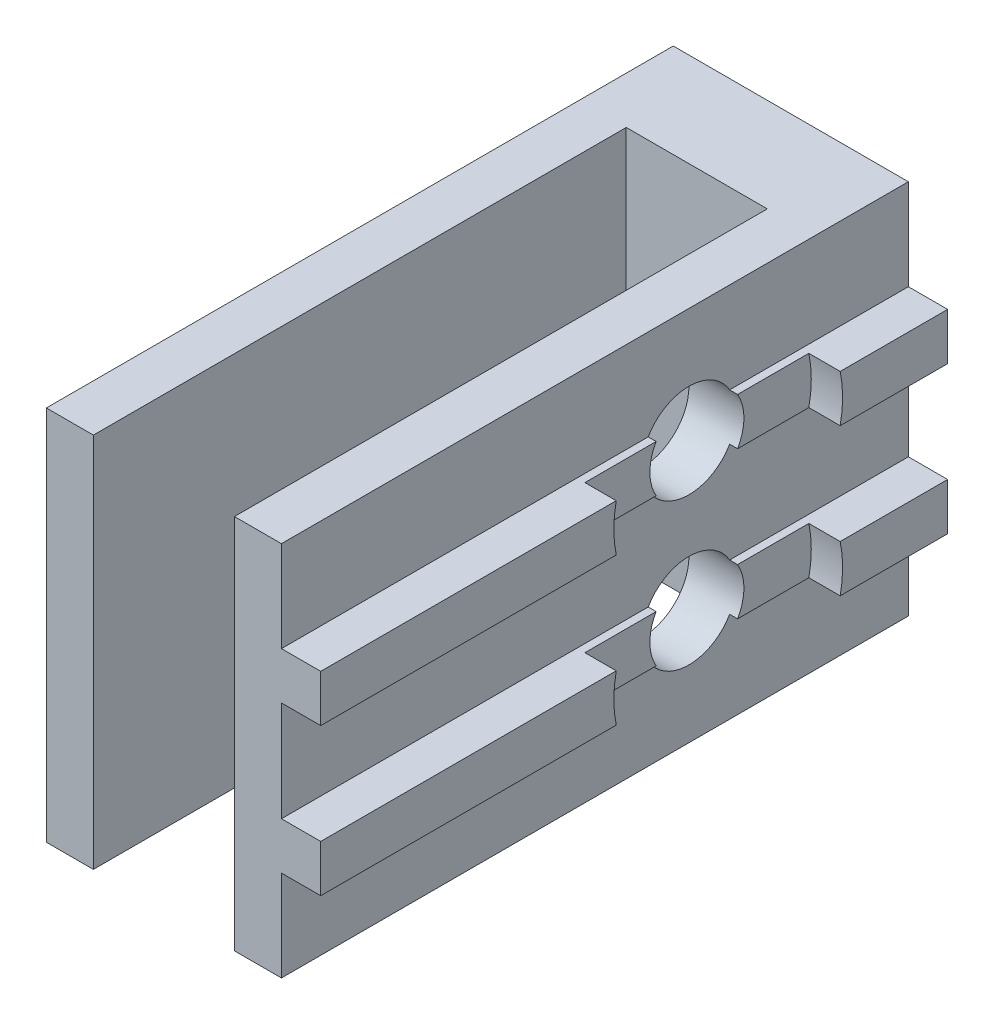
ISO-10303-21;
HEADER;
FILE_DESCRIPTION(('STEP AP214'),'2;1');
FILE_NAME('part.step','',(''),(''),'','','');
FILE_SCHEMA(('AUTOMOTIVE_DESIGN { 1 0 10303 214 1 1 1 1 }'));
ENDSEC;
DATA;
#1=APPLICATION_CONTEXT('core data for automotive mechanical design processes');
#2=APPLICATION_PROTOCOL_DEFINITION('international standard','automotive_design',2000,#1);
#3=PRODUCT_CONTEXT('',#1,'mechanical');
#4=PRODUCT('Part','Part','',(#3));
#5=PRODUCT_RELATED_PRODUCT_CATEGORY('part','',(#4));
#6=PRODUCT_DEFINITION_FORMATION('','',#4);
#7=PRODUCT_DEFINITION_CONTEXT('part definition',#1,'design');
#8=PRODUCT_DEFINITION('design','',#6,#7);
#9=PRODUCT_DEFINITION_SHAPE('','',#8);
#10=(LENGTH_UNIT() NAMED_UNIT(*) SI_UNIT(.MILLI.,.METRE.));
#11=(NAMED_UNIT(*) PLANE_ANGLE_UNIT() SI_UNIT($,.RADIAN.));
#12=(NAMED_UNIT(*) SI_UNIT($,.STERADIAN.) SOLID_ANGLE_UNIT());
#13=UNCERTAINTY_MEASURE_WITH_UNIT(LENGTH_MEASURE(1.E-05),#10,'distance_accuracy_value','');
#14=(GEOMETRIC_REPRESENTATION_CONTEXT(3) GLOBAL_UNCERTAINTY_ASSIGNED_CONTEXT((#13)) GLOBAL_UNIT_ASSIGNED_CONTEXT((#10,
#11,#12)) REPRESENTATION_CONTEXT('',''));
#15=CARTESIAN_POINT('',(0.,0.,0.));
#16=DIRECTION('',(0.,0.,1.));
#17=DIRECTION('',(1.,0.,0.));
#18=AXIS2_PLACEMENT_3D('',#15,#16,#17);
#19=CARTESIAN_POINT('',(8.75318938842675,2.9,20.));
#20=DIRECTION('',(0.,1.,0.));
#21=DIRECTION('',(-1.,0.,0.));
#22=AXIS2_PLACEMENT_3D('',#19,#20,#21);
#23=PLANE('',#22);
#24=DIRECTION('',(0.,0.,-1.));
#25=VECTOR('',#24,1.);
#26=CARTESIAN_POINT('',(7.5,2.9,20.));
#27=LINE('',#26,#25);
#28=CARTESIAN_POINT('',(7.5,2.9,20.));
#29=VERTEX_POINT('',#28);
#30=CARTESIAN_POINT('',(7.5,2.9,8.29903810567666));
#31=VERTEX_POINT('',#30);
#32=EDGE_CURVE('E410',#29,#31,#27,.T.);
#33=ORIENTED_EDGE('',*,*,#32,.T.);
#34=DIRECTION('',(1.,0.,0.));
#35=VECTOR('',#34,1.);
#36=CARTESIAN_POINT('',(-2.74264068711929,2.89999999999999,8.29903810567665));
#37=LINE('',#36,#35);
#38=CARTESIAN_POINT('',(7.75318938842676,2.89999999999999,8.29903810567665));
#39=VERTEX_POINT('',#38);
#40=EDGE_CURVE('E483',#31,#39,#37,.T.);
#41=ORIENTED_EDGE('',*,*,#40,.T.);
#42=DIRECTION('',(0.,0.,-1.));
#43=VECTOR('',#42,1.);
#44=CARTESIAN_POINT('',(7.75318938842676,2.9,20.));
#45=LINE('',#44,#43);
#46=CARTESIAN_POINT('',(7.75318938842676,2.9,10.5721142198983));
#47=VERTEX_POINT('',#46);
#48=EDGE_CURVE('E270',#47,#39,#45,.T.);
#49=ORIENTED_EDGE('',*,*,#48,.F.);
#50=DIRECTION('',(1.,0.,0.));
#51=VECTOR('',#50,1.);
#52=CARTESIAN_POINT('',(7.75318938842676,2.9,10.5721142198983));
#53=LINE('',#52,#51);
#54=CARTESIAN_POINT('',(8.75318938842675,2.9,10.5721142198983));
#55=VERTEX_POINT('',#54);
#56=EDGE_CURVE('E286',#47,#55,#53,.T.);
#57=ORIENTED_EDGE('',*,*,#56,.T.);
#58=DIRECTION('',(0.,0.,-1.));
#59=VECTOR('',#58,1.);
#60=CARTESIAN_POINT('',(8.75318938842675,2.9,20.));
#61=LINE('',#60,#59);
#62=CARTESIAN_POINT('',(8.75318938842675,2.9,20.));
#63=VERTEX_POINT('',#62);
#64=EDGE_CURVE('E406',#63,#55,#61,.T.);
#65=ORIENTED_EDGE('',*,*,#64,.F.);
#66=DIRECTION('',(1.,0.,0.));
#67=VECTOR('',#66,1.);
#68=CARTESIAN_POINT('',(8.75318938842675,2.9,20.));
#69=LINE('',#68,#67);
#70=EDGE_CURVE('E326',#29,#63,#69,.T.);
#71=ORIENTED_EDGE('',*,*,#70,.F.);
#72=EDGE_LOOP('',(#33,#41,#49,#57,#65,#71));
#73=FACE_BOUND('',#72,.T.);
#74=ADVANCED_FACE('F35',(#73),#23,.F.);
#75=CARTESIAN_POINT('',(7.5,4.4,20.));
#76=DIRECTION('',(0.,-1.,0.));
#77=DIRECTION('',(0.,0.,-1.));
#78=AXIS2_PLACEMENT_3D('',#75,#76,#77);
#79=PLANE('',#78);
#80=DIRECTION('',(0.,0.,-1.));
#81=VECTOR('',#80,1.);
#82=CARTESIAN_POINT('',(7.5,4.4,20.));
#83=LINE('',#82,#81);
#84=CARTESIAN_POINT('',(7.5,4.4,5.70096189432334));
#85=VERTEX_POINT('',#84);
#86=CARTESIAN_POINT('',(7.5,4.4,0.));
#87=VERTEX_POINT('',#86);
#88=EDGE_CURVE('E262',#85,#87,#83,.T.);
#89=ORIENTED_EDGE('',*,*,#88,.F.);
#90=DIRECTION('',(1.,0.,0.));
#91=VECTOR('',#90,1.);
#92=CARTESIAN_POINT('',(-2.74264068711929,4.4,5.70096189432334));
#93=LINE('',#92,#91);
#94=CARTESIAN_POINT('',(7.75318938842676,4.4,5.70096189432334));
#95=VERTEX_POINT('',#94);
#96=EDGE_CURVE('E249',#85,#95,#93,.T.);
#97=ORIENTED_EDGE('',*,*,#96,.T.);
#98=DIRECTION('',(0.,0.,1.));
#99=VECTOR('',#98,1.);
#100=CARTESIAN_POINT('',(7.75318938842676,4.4,20.));
#101=LINE('',#100,#99);
#102=CARTESIAN_POINT('',(7.75318938842676,4.4,3.42788578010165));
#103=VERTEX_POINT('',#102);
#104=EDGE_CURVE('E260',#103,#95,#101,.T.);
#105=ORIENTED_EDGE('',*,*,#104,.F.);
#106=DIRECTION('',(1.,0.,0.));
#107=VECTOR('',#106,1.);
#108=CARTESIAN_POINT('',(7.75318938842676,4.4,3.42788578010165));
#109=LINE('',#108,#107);
#110=CARTESIAN_POINT('',(8.75318938842675,4.4,3.42788578010165));
#111=VERTEX_POINT('',#110);
#112=EDGE_CURVE('E11',#103,#111,#109,.T.);
#113=ORIENTED_EDGE('',*,*,#112,.T.);
#114=DIRECTION('',(0.,0.,-1.));
#115=VECTOR('',#114,1.);
#116=CARTESIAN_POINT('',(8.75318938842675,4.4,20.));
#117=LINE('',#116,#115);
#118=CARTESIAN_POINT('',(8.75318938842675,4.4,0.));
#119=VERTEX_POINT('',#118);
#120=EDGE_CURVE('E401',#111,#119,#117,.T.);
#121=ORIENTED_EDGE('',*,*,#120,.T.);
#122=DIRECTION('',(-1.,0.,0.));
#123=VECTOR('',#122,1.);
#124=CARTESIAN_POINT('',(7.5,4.4,0.));
#125=LINE('',#124,#123);
#126=EDGE_CURVE('E360',#119,#87,#125,.T.);
#127=ORIENTED_EDGE('',*,*,#126,.T.);
#128=EDGE_LOOP('',(#89,#97,#105,#113,#121,#127));
#129=FACE_BOUND('',#128,.T.);
#130=ADVANCED_FACE('F259',(#129),#79,.F.);
#131=CARTESIAN_POINT('',(8.75318938842675,7.6,20.));
#132=DIRECTION('',(0.,1.,0.));
#133=DIRECTION('',(-1.,0.,0.));
#134=AXIS2_PLACEMENT_3D('',#131,#132,#133);
#135=PLANE('',#134);
#136=DIRECTION('',(0.,0.,-1.));
#137=VECTOR('',#136,1.);
#138=CARTESIAN_POINT('',(7.5,7.6,20.));
#139=LINE('',#138,#137);
#140=CARTESIAN_POINT('',(7.5,7.6,20.));
#141=VERTEX_POINT('',#140);
#142=CARTESIAN_POINT('',(7.5,7.6,8.29903810567666));
#143=VERTEX_POINT('',#142);
#144=EDGE_CURVE('E395',#141,#143,#139,.T.);
#145=ORIENTED_EDGE('',*,*,#144,.T.);
#146=DIRECTION('',(1.,0.,0.));
#147=VECTOR('',#146,1.);
#148=CARTESIAN_POINT('',(-2.74264068711929,7.59999999999999,8.29903810567665));
#149=LINE('',#148,#147);
#150=CARTESIAN_POINT('',(7.75318938842676,7.59999999999999,8.29903810567665));
#151=VERTEX_POINT('',#150);
#152=EDGE_CURVE('E467',#143,#151,#149,.T.);
#153=ORIENTED_EDGE('',*,*,#152,.T.);
#154=DIRECTION('',(0.,0.,-1.));
#155=VECTOR('',#154,1.);
#156=CARTESIAN_POINT('',(7.75318938842676,7.6,20.));
#157=LINE('',#156,#155);
#158=CARTESIAN_POINT('',(7.75318938842676,7.6,10.5721142198983));
#159=VERTEX_POINT('',#158);
#160=EDGE_CURVE('E272',#159,#151,#157,.T.);
#161=ORIENTED_EDGE('',*,*,#160,.F.);
#162=DIRECTION('',(1.,0.,0.));
#163=VECTOR('',#162,1.);
#164=CARTESIAN_POINT('',(7.75318938842676,7.6,10.5721142198983));
#165=LINE('',#164,#163);
#166=CARTESIAN_POINT('',(8.75318938842675,7.6,10.5721142198983));
#167=VERTEX_POINT('',#166);
#168=EDGE_CURVE('E280',#159,#167,#165,.T.);
#169=ORIENTED_EDGE('',*,*,#168,.T.);
#170=DIRECTION('',(0.,0.,-1.));
#171=VECTOR('',#170,1.);
#172=CARTESIAN_POINT('',(8.75318938842675,7.6,20.));
#173=LINE('',#172,#171);
#174=CARTESIAN_POINT('',(8.75318938842675,7.6,20.));
#175=VERTEX_POINT('',#174);
#176=EDGE_CURVE('E391',#175,#167,#173,.T.);
#177=ORIENTED_EDGE('',*,*,#176,.F.);
#178=DIRECTION('',(1.,0.,0.));
#179=VECTOR('',#178,1.);
#180=CARTESIAN_POINT('',(8.75318938842675,7.6,20.));
#181=LINE('',#180,#179);
#182=EDGE_CURVE('E334',#141,#175,#181,.T.);
#183=ORIENTED_EDGE('',*,*,#182,.F.);
#184=EDGE_LOOP('',(#145,#153,#161,#169,#177,#183));
#185=FACE_BOUND('',#184,.T.);
#186=ADVANCED_FACE('F541',(#185),#135,.F.);
#187=CARTESIAN_POINT('',(7.5,9.1,20.));
#188=DIRECTION('',(0.,-1.,0.));
#189=DIRECTION('',(0.,0.,-1.));
#190=AXIS2_PLACEMENT_3D('',#187,#188,#189);
#191=PLANE('',#190);
#192=DIRECTION('',(0.,0.,-1.));
#193=VECTOR('',#192,1.);
#194=CARTESIAN_POINT('',(7.5,9.1,20.));
#195=LINE('',#194,#193);
#196=CARTESIAN_POINT('',(7.5,9.1,5.70096189432334));
#197=VERTEX_POINT('',#196);
#198=CARTESIAN_POINT('',(7.5,9.1,0.));
#199=VERTEX_POINT('',#198);
#200=EDGE_CURVE('E382',#197,#199,#195,.T.);
#201=ORIENTED_EDGE('',*,*,#200,.F.);
#202=DIRECTION('',(1.,0.,0.));
#203=VECTOR('',#202,1.);
#204=CARTESIAN_POINT('',(-2.74264068711929,9.1,5.70096189432334));
#205=LINE('',#204,#203);
#206=CARTESIAN_POINT('',(7.75318938842676,9.1,5.70096189432334));
#207=VERTEX_POINT('',#206);
#208=EDGE_CURVE('E460',#197,#207,#205,.T.);
#209=ORIENTED_EDGE('',*,*,#208,.T.);
#210=DIRECTION('',(0.,0.,1.));
#211=VECTOR('',#210,1.);
#212=CARTESIAN_POINT('',(7.75318938842676,9.1,20.));
#213=LINE('',#212,#211);
#214=CARTESIAN_POINT('',(7.75318938842676,9.1,3.42788578010165));
#215=VERTEX_POINT('',#214);
#216=EDGE_CURVE('E422',#215,#207,#213,.T.);
#217=ORIENTED_EDGE('',*,*,#216,.F.);
#218=DIRECTION('',(1.,0.,0.));
#219=VECTOR('',#218,1.);
#220=CARTESIAN_POINT('',(7.75318938842676,9.1,3.42788578010165));
#221=LINE('',#220,#219);
#222=CARTESIAN_POINT('',(8.75318938842675,9.1,3.42788578010165));
#223=VERTEX_POINT('',#222);
#224=EDGE_CURVE('E425',#215,#223,#221,.T.);
#225=ORIENTED_EDGE('',*,*,#224,.T.);
#226=DIRECTION('',(0.,0.,-1.));
#227=VECTOR('',#226,1.);
#228=CARTESIAN_POINT('',(8.75318938842675,9.1,20.));
#229=LINE('',#228,#227);
#230=CARTESIAN_POINT('',(8.75318938842675,9.1,0.));
#231=VERTEX_POINT('',#230);
#232=EDGE_CURVE('E386',#223,#231,#229,.T.);
#233=ORIENTED_EDGE('',*,*,#232,.T.);
#234=DIRECTION('',(-1.,0.,0.));
#235=VECTOR('',#234,1.);
#236=CARTESIAN_POINT('',(7.5,9.1,0.));
#237=LINE('',#236,#235);
#238=EDGE_CURVE('E371',#231,#199,#237,.T.);
#239=ORIENTED_EDGE('',*,*,#238,.T.);
#240=EDGE_LOOP('',(#201,#209,#217,#225,#233,#239));
#241=FACE_BOUND('',#240,.T.);
#242=ADVANCED_FACE('F641',(#241),#191,.F.);
#243=CARTESIAN_POINT('',(8.75318938842675,4.4,20.));
#244=DIRECTION('',(-1.,0.,0.));
#245=DIRECTION('',(0.,0.,1.));
#246=AXIS2_PLACEMENT_3D('',#243,#244,#245);
#247=PLANE('',#246);
#248=ORIENTED_EDGE('',*,*,#120,.F.);
#249=CARTESIAN_POINT('',(8.75318938842675,3.65,7.));
#250=DIRECTION('',(1.,0.,0.));
#251=DIRECTION('',(0.,0.,-1.));
#252=AXIS2_PLACEMENT_3D('',#249,#250,#251);
#253=CIRCLE('',#252,3.65);
#254=CARTESIAN_POINT('',(8.75318938842675,2.9,3.42788578010165));
#255=VERTEX_POINT('',#254);
#256=EDGE_CURVE('E446',#255,#111,#253,.T.);
#257=ORIENTED_EDGE('',*,*,#256,.F.);
#258=CARTESIAN_POINT('',(8.75318938842675,2.9,0.));
#259=VERTEX_POINT('',#258);
#260=EDGE_CURVE('E405',#255,#259,#61,.T.);
#261=ORIENTED_EDGE('',*,*,#260,.T.);
#262=DIRECTION('',(0.,1.,0.));
#263=VECTOR('',#262,1.);
#264=CARTESIAN_POINT('',(8.75318938842675,4.4,0.));
#265=LINE('',#264,#263);
#266=EDGE_CURVE('E357',#259,#119,#265,.T.);
#267=ORIENTED_EDGE('',*,*,#266,.T.);
#268=EDGE_LOOP('',(#248,#257,#261,#267));
#269=FACE_BOUND('',#268,.T.);
#270=ADVANCED_FACE('F508',(#269),#247,.F.);
#271=CARTESIAN_POINT('',(8.75318938842675,9.1,20.));
#272=DIRECTION('',(-1.,0.,0.));
#273=DIRECTION('',(0.,0.,1.));
#274=AXIS2_PLACEMENT_3D('',#271,#272,#273);
#275=PLANE('',#274);
#276=ORIENTED_EDGE('',*,*,#232,.F.);
#277=CARTESIAN_POINT('',(8.75318938842675,8.35,7.));
#278=DIRECTION('',(1.,0.,0.));
#279=DIRECTION('',(0.,0.,-1.));
#280=AXIS2_PLACEMENT_3D('',#277,#278,#279);
#281=CIRCLE('',#280,3.65);
#282=CARTESIAN_POINT('',(8.75318938842675,7.6,3.42788578010165));
#283=VERTEX_POINT('',#282);
#284=EDGE_CURVE('E448',#283,#223,#281,.T.);
#285=ORIENTED_EDGE('',*,*,#284,.F.);
#286=CARTESIAN_POINT('',(8.75318938842675,7.6,0.));
#287=VERTEX_POINT('',#286);
#288=EDGE_CURVE('E390',#283,#287,#173,.T.);
#289=ORIENTED_EDGE('',*,*,#288,.T.);
#290=DIRECTION('',(0.,1.,0.));
#291=VECTOR('',#290,1.);
#292=CARTESIAN_POINT('',(8.75318938842675,9.1,0.));
#293=LINE('',#292,#291);
#294=EDGE_CURVE('E368',#287,#231,#293,.T.);
#295=ORIENTED_EDGE('',*,*,#294,.T.);
#296=EDGE_LOOP('',(#276,#285,#289,#295));
#297=FACE_BOUND('',#296,.T.);
#298=ADVANCED_FACE('F645',(#297),#275,.F.);
#299=CARTESIAN_POINT('',(0.,12.,20.));
#300=DIRECTION('',(0.,0.,-1.));
#301=DIRECTION('',(-1.,0.,0.));
#302=AXIS2_PLACEMENT_3D('',#299,#300,#301);
#303=PLANE('',#302);
#304=DIRECTION('',(1.,0.,0.));
#305=VECTOR('',#304,1.);
#306=CARTESIAN_POINT('',(0.,0.,20.));
#307=LINE('',#306,#305);
#308=CARTESIAN_POINT('',(0.,0.,20.));
#309=VERTEX_POINT('',#308);
#310=CARTESIAN_POINT('',(1.5,0.,20.));
#311=VERTEX_POINT('',#310);
#312=EDGE_CURVE('E321',#309,#311,#307,.T.);
#313=ORIENTED_EDGE('',*,*,#312,.T.);
#314=DIRECTION('',(0.,-1.,0.));
#315=VECTOR('',#314,1.);
#316=CARTESIAN_POINT('',(1.5,12.,20.));
#317=LINE('',#316,#315);
#318=CARTESIAN_POINT('',(1.5,12.,20.));
#319=VERTEX_POINT('',#318);
#320=EDGE_CURVE('E289',#319,#311,#317,.T.);
#321=ORIENTED_EDGE('',*,*,#320,.F.);
#322=DIRECTION('',(-1.,0.,0.));
#323=VECTOR('',#322,1.);
#324=CARTESIAN_POINT('',(0.,12.,20.));
#325=LINE('',#324,#323);
#326=CARTESIAN_POINT('',(0.,12.,20.));
#327=VERTEX_POINT('',#326);
#328=EDGE_CURVE('E342',#319,#327,#325,.T.);
#329=ORIENTED_EDGE('',*,*,#328,.T.);
#330=DIRECTION('',(0.,-1.,0.));
#331=VECTOR('',#330,1.);
#332=CARTESIAN_POINT('',(0.,0.,20.));
#333=LINE('',#332,#331);
#334=EDGE_CURVE('E316',#327,#309,#333,.T.);
#335=ORIENTED_EDGE('',*,*,#334,.T.);
#336=EDGE_LOOP('',(#313,#321,#329,#335));
#337=FACE_BOUND('',#336,.T.);
#338=ADVANCED_FACE('F597',(#337),#303,.F.);
#339=CARTESIAN_POINT('',(0.,0.,20.));
#340=DIRECTION('',(1.,0.,0.));
#341=DIRECTION('',(0.,0.,-1.));
#342=AXIS2_PLACEMENT_3D('',#339,#340,#341);
#343=PLANE('',#342);
#344=DIRECTION('',(0.,-1.,0.));
#345=VECTOR('',#344,1.);
#346=CARTESIAN_POINT('',(0.,0.,0.));
#347=LINE('',#346,#345);
#348=CARTESIAN_POINT('',(0.,12.,0.));
#349=VERTEX_POINT('',#348);
#350=CARTESIAN_POINT('',(0.,0.,0.));
#351=VERTEX_POINT('',#350);
#352=EDGE_CURVE('E308',#349,#351,#347,.T.);
#353=ORIENTED_EDGE('',*,*,#352,.T.);
#354=DIRECTION('',(0.,0.,-1.));
#355=VECTOR('',#354,1.);
#356=CARTESIAN_POINT('',(0.,0.,20.));
#357=LINE('',#356,#355);
#358=EDGE_CURVE('E416',#309,#351,#357,.T.);
#359=ORIENTED_EDGE('',*,*,#358,.F.);
#360=ORIENTED_EDGE('',*,*,#334,.F.);
#361=DIRECTION('',(0.,0.,-1.));
#362=VECTOR('',#361,1.);
#363=CARTESIAN_POINT('',(0.,12.,20.));
#364=LINE('',#363,#362);
#365=EDGE_CURVE('E346',#327,#349,#364,.T.);
#366=ORIENTED_EDGE('',*,*,#365,.T.);
#367=EDGE_LOOP('',(#353,#359,#360,#366));
#368=FACE_BOUND('',#367,.T.);
#369=ADVANCED_FACE('F37',(#368),#343,.F.);
#370=CARTESIAN_POINT('',(0.,0.,20.));
#371=DIRECTION('',(0.,1.,0.));
#372=DIRECTION('',(0.,0.,1.));
#373=AXIS2_PLACEMENT_3D('',#370,#371,#372);
#374=PLANE('',#373);
#375=DIRECTION('',(1.,0.,0.));
#376=VECTOR('',#375,1.);
#377=CARTESIAN_POINT('',(1.5,0.,3.));
#378=LINE('',#377,#376);
#379=CARTESIAN_POINT('',(1.5,0.,3.));
#380=VERTEX_POINT('',#379);
#381=CARTESIAN_POINT('',(6.,0.,3.));
#382=VERTEX_POINT('',#381);
#383=EDGE_CURVE('E293',#380,#382,#378,.T.);
#384=ORIENTED_EDGE('',*,*,#383,.F.);
#385=DIRECTION('',(0.,0.,1.));
#386=VECTOR('',#385,1.);
#387=CARTESIAN_POINT('',(1.5,0.,3.));
#388=LINE('',#387,#386);
#389=EDGE_CURVE('E303',#380,#311,#388,.T.);
#390=ORIENTED_EDGE('',*,*,#389,.T.);
#391=ORIENTED_EDGE('',*,*,#312,.F.);
#392=ORIENTED_EDGE('',*,*,#358,.T.);
#393=DIRECTION('',(1.,0.,0.));
#394=VECTOR('',#393,1.);
#395=CARTESIAN_POINT('',(0.,0.,0.));
#396=LINE('',#395,#394);
#397=CARTESIAN_POINT('',(7.5,0.,0.));
#398=VERTEX_POINT('',#397);
#399=EDGE_CURVE('E349',#351,#398,#396,.T.);
#400=ORIENTED_EDGE('',*,*,#399,.T.);
#401=DIRECTION('',(0.,0.,-1.));
#402=VECTOR('',#401,1.);
#403=CARTESIAN_POINT('',(7.5,0.,20.));
#404=LINE('',#403,#402);
#405=CARTESIAN_POINT('',(7.5,0.,20.));
#406=VERTEX_POINT('',#405);
#407=EDGE_CURVE('E413',#406,#398,#404,.T.);
#408=ORIENTED_EDGE('',*,*,#407,.F.);
#409=CARTESIAN_POINT('',(6.,0.,20.));
#410=VERTEX_POINT('',#409);
#411=EDGE_CURVE('E319',#410,#406,#307,.T.);
#412=ORIENTED_EDGE('',*,*,#411,.F.);
#413=DIRECTION('',(0.,0.,1.));
#414=VECTOR('',#413,1.);
#415=CARTESIAN_POINT('',(6.,0.,3.));
#416=LINE('',#415,#414);
#417=EDGE_CURVE('E312',#382,#410,#416,.T.);
#418=ORIENTED_EDGE('',*,*,#417,.F.);
#419=EDGE_LOOP('',(#384,#390,#391,#392,#400,#408,#412,#418));
#420=FACE_BOUND('',#419,.T.);
#421=ADVANCED_FACE('F589',(#420),#374,.F.);
#422=CARTESIAN_POINT('',(7.5,0.,20.));
#423=DIRECTION('',(-1.,0.,0.));
#424=DIRECTION('',(0.,0.,1.));
#425=AXIS2_PLACEMENT_3D('',#422,#423,#424);
#426=PLANE('',#425);
#427=CARTESIAN_POINT('',(7.5,2.89999999999999,5.70096189432335));
#428=VERTEX_POINT('',#427);
#429=CARTESIAN_POINT('',(7.5,2.9,0.));
#430=VERTEX_POINT('',#429);
#431=EDGE_CURVE('E409',#428,#430,#27,.T.);
#432=ORIENTED_EDGE('',*,*,#431,.F.);
#433=CARTESIAN_POINT('',(7.5,3.65,7.));
#434=DIRECTION('',(-1.,0.,0.));
#435=DIRECTION('',(0.,0.,1.));
#436=AXIS2_PLACEMENT_3D('',#433,#434,#435);
#437=CIRCLE('',#436,1.5);
#438=EDGE_CURVE('E486',#428,#31,#437,.T.);
#439=ORIENTED_EDGE('',*,*,#438,.T.);
#440=ORIENTED_EDGE('',*,*,#32,.F.);
#441=DIRECTION('',(0.,1.,0.));
#442=VECTOR('',#441,1.);
#443=CARTESIAN_POINT('',(7.5,0.,20.));
#444=LINE('',#443,#442);
#445=EDGE_CURVE('E324',#406,#29,#444,.T.);
#446=ORIENTED_EDGE('',*,*,#445,.F.);
#447=ORIENTED_EDGE('',*,*,#407,.T.);
#448=DIRECTION('',(0.,1.,0.));
#449=VECTOR('',#448,1.);
#450=CARTESIAN_POINT('',(7.5,0.,0.));
#451=LINE('',#450,#449);
#452=EDGE_CURVE('E351',#398,#430,#451,.T.);
#453=ORIENTED_EDGE('',*,*,#452,.T.);
#454=EDGE_LOOP('',(#432,#439,#440,#446,#447,#453));
#455=FACE_BOUND('',#454,.T.);
#456=ADVANCED_FACE('F493',(#455),#426,.F.);
#457=CARTESIAN_POINT('',(7.75318938842676,2.9,5.70096189432334));
#458=VERTEX_POINT('',#457);
#459=CARTESIAN_POINT('',(7.75318938842676,2.9,3.42788578010165));
#460=VERTEX_POINT('',#459);
#461=EDGE_CURVE('E267',#458,#460,#45,.T.);
#462=ORIENTED_EDGE('',*,*,#461,.F.);
#463=DIRECTION('',(1.,0.,0.));
#464=VECTOR('',#463,1.);
#465=CARTESIAN_POINT('',(-2.74264068711929,2.89999999999999,5.70096189432335));
#466=LINE('',#465,#464);
#467=EDGE_CURVE('E252',#458,#428,#466,.F.);
#468=ORIENTED_EDGE('',*,*,#467,.T.);
#469=ORIENTED_EDGE('',*,*,#431,.T.);
#470=DIRECTION('',(1.,0.,0.));
#471=VECTOR('',#470,1.);
#472=CARTESIAN_POINT('',(8.75318938842675,2.9,0.));
#473=LINE('',#472,#471);
#474=EDGE_CURVE('E354',#430,#259,#473,.T.);
#475=ORIENTED_EDGE('',*,*,#474,.T.);
#476=ORIENTED_EDGE('',*,*,#260,.F.);
#477=DIRECTION('',(1.,0.,0.));
#478=VECTOR('',#477,1.);
#479=CARTESIAN_POINT('',(7.75318938842676,2.9,3.42788578010165));
#480=LINE('',#479,#478);
#481=EDGE_CURVE('E283',#255,#460,#480,.F.);
#482=ORIENTED_EDGE('',*,*,#481,.T.);
#483=EDGE_LOOP('',(#462,#468,#469,#475,#476,#482));
#484=FACE_BOUND('',#483,.T.);
#485=ADVANCED_FACE('F491',(#484),#23,.F.);
#486=ORIENTED_EDGE('',*,*,#64,.T.);
#487=CARTESIAN_POINT('',(8.75318938842675,4.4,10.5721142198983));
#488=VERTEX_POINT('',#487);
#489=EDGE_CURVE('E438',#488,#55,#253,.T.);
#490=ORIENTED_EDGE('',*,*,#489,.F.);
#491=CARTESIAN_POINT('',(8.75318938842675,4.4,20.));
#492=VERTEX_POINT('',#491);
#493=EDGE_CURVE('E402',#492,#488,#117,.T.);
#494=ORIENTED_EDGE('',*,*,#493,.F.);
#495=DIRECTION('',(0.,1.,0.));
#496=VECTOR('',#495,1.);
#497=CARTESIAN_POINT('',(8.75318938842675,4.4,20.));
#498=LINE('',#497,#496);
#499=EDGE_CURVE('E328',#63,#492,#498,.T.);
#500=ORIENTED_EDGE('',*,*,#499,.F.);
#501=EDGE_LOOP('',(#486,#490,#494,#500));
#502=FACE_BOUND('',#501,.T.);
#503=ADVANCED_FACE('F442',(#502),#247,.F.);
#504=CARTESIAN_POINT('',(7.75318938842676,4.4,8.29903810567666));
#505=VERTEX_POINT('',#504);
#506=CARTESIAN_POINT('',(7.75318938842676,4.4,10.5721142198983));
#507=VERTEX_POINT('',#506);
#508=EDGE_CURVE('E268',#505,#507,#101,.T.);
#509=ORIENTED_EDGE('',*,*,#508,.F.);
#510=DIRECTION('',(1.,0.,0.));
#511=VECTOR('',#510,1.);
#512=CARTESIAN_POINT('',(-2.74264068711929,4.4,8.29903810567666));
#513=LINE('',#512,#511);
#514=CARTESIAN_POINT('',(7.5,4.4,8.29903810567666));
#515=VERTEX_POINT('',#514);
#516=EDGE_CURVE('E481',#505,#515,#513,.F.);
#517=ORIENTED_EDGE('',*,*,#516,.T.);
#518=CARTESIAN_POINT('',(7.5,4.4,20.));
#519=VERTEX_POINT('',#518);
#520=EDGE_CURVE('E398',#519,#515,#83,.T.);
#521=ORIENTED_EDGE('',*,*,#520,.F.);
#522=DIRECTION('',(-1.,0.,0.));
#523=VECTOR('',#522,1.);
#524=CARTESIAN_POINT('',(7.5,4.4,20.));
#525=LINE('',#524,#523);
#526=EDGE_CURVE('E330',#492,#519,#525,.T.);
#527=ORIENTED_EDGE('',*,*,#526,.F.);
#528=ORIENTED_EDGE('',*,*,#493,.T.);
#529=DIRECTION('',(1.,0.,0.));
#530=VECTOR('',#529,1.);
#531=CARTESIAN_POINT('',(7.75318938842676,4.4,10.5721142198983));
#532=LINE('',#531,#530);
#533=EDGE_CURVE('E43',#488,#507,#532,.F.);
#534=ORIENTED_EDGE('',*,*,#533,.T.);
#535=EDGE_LOOP('',(#509,#517,#521,#527,#528,#534));
#536=FACE_BOUND('',#535,.T.);
#537=ADVANCED_FACE('F430',(#536),#79,.F.);
#538=CARTESIAN_POINT('',(7.5,7.6,20.));
#539=DIRECTION('',(-1.,0.,0.));
#540=DIRECTION('',(0.,0.,1.));
#541=AXIS2_PLACEMENT_3D('',#538,#539,#540);
#542=PLANE('',#541);
#543=ORIENTED_EDGE('',*,*,#520,.T.);
#544=CARTESIAN_POINT('',(7.5,3.65,7.));
#545=DIRECTION('',(-1.,0.,0.));
#546=DIRECTION('',(0.,0.,1.));
#547=AXIS2_PLACEMENT_3D('',#544,#545,#546);
#548=CIRCLE('',#547,1.5);
#549=EDGE_CURVE('E264',#515,#85,#548,.T.);
#550=ORIENTED_EDGE('',*,*,#549,.T.);
#551=ORIENTED_EDGE('',*,*,#88,.T.);
#552=DIRECTION('',(0.,1.,0.));
#553=VECTOR('',#552,1.);
#554=CARTESIAN_POINT('',(7.5,7.6,0.));
#555=LINE('',#554,#553);
#556=CARTESIAN_POINT('',(7.5,7.6,0.));
#557=VERTEX_POINT('',#556);
#558=EDGE_CURVE('E362',#87,#557,#555,.T.);
#559=ORIENTED_EDGE('',*,*,#558,.T.);
#560=CARTESIAN_POINT('',(7.5,7.59999999999999,5.70096189432335));
#561=VERTEX_POINT('',#560);
#562=EDGE_CURVE('E394',#561,#557,#139,.T.);
#563=ORIENTED_EDGE('',*,*,#562,.F.);
#564=CARTESIAN_POINT('',(7.5,8.35,7.));
#565=DIRECTION('',(-1.,0.,0.));
#566=DIRECTION('',(0.,0.,1.));
#567=AXIS2_PLACEMENT_3D('',#564,#565,#566);
#568=CIRCLE('',#567,1.5);
#569=EDGE_CURVE('E470',#561,#143,#568,.T.);
#570=ORIENTED_EDGE('',*,*,#569,.T.);
#571=ORIENTED_EDGE('',*,*,#144,.F.);
#572=DIRECTION('',(0.,1.,0.));
#573=VECTOR('',#572,1.);
#574=CARTESIAN_POINT('',(7.5,7.6,20.));
#575=LINE('',#574,#573);
#576=EDGE_CURVE('E332',#519,#141,#575,.T.);
#577=ORIENTED_EDGE('',*,*,#576,.F.);
#578=EDGE_LOOP('',(#543,#550,#551,#559,#563,#570,#571,#577));
#579=FACE_BOUND('',#578,.T.);
#580=ADVANCED_FACE('F516',(#579),#542,.F.);
#581=CARTESIAN_POINT('',(7.75318938842676,7.6,5.70096189432334));
#582=VERTEX_POINT('',#581);
#583=CARTESIAN_POINT('',(7.75318938842676,7.6,3.42788578010165));
#584=VERTEX_POINT('',#583);
#585=EDGE_CURVE('E274',#582,#584,#157,.T.);
#586=ORIENTED_EDGE('',*,*,#585,.F.);
#587=DIRECTION('',(1.,0.,0.));
#588=VECTOR('',#587,1.);
#589=CARTESIAN_POINT('',(-2.74264068711929,7.59999999999999,5.70096189432335));
#590=LINE('',#589,#588);
#591=EDGE_CURVE('E473',#582,#561,#590,.F.);
#592=ORIENTED_EDGE('',*,*,#591,.T.);
#593=ORIENTED_EDGE('',*,*,#562,.T.);
#594=DIRECTION('',(1.,0.,0.));
#595=VECTOR('',#594,1.);
#596=CARTESIAN_POINT('',(8.75318938842675,7.6,0.));
#597=LINE('',#596,#595);
#598=EDGE_CURVE('E365',#557,#287,#597,.T.);
#599=ORIENTED_EDGE('',*,*,#598,.T.);
#600=ORIENTED_EDGE('',*,*,#288,.F.);
#601=DIRECTION('',(1.,0.,0.));
#602=VECTOR('',#601,1.);
#603=CARTESIAN_POINT('',(7.75318938842676,7.6,3.42788578010165));
#604=LINE('',#603,#602);
#605=EDGE_CURVE('E277',#283,#584,#604,.F.);
#606=ORIENTED_EDGE('',*,*,#605,.T.);
#607=EDGE_LOOP('',(#586,#592,#593,#599,#600,#606));
#608=FACE_BOUND('',#607,.T.);
#609=ADVANCED_FACE('F644',(#608),#135,.F.);
#610=ORIENTED_EDGE('',*,*,#176,.T.);
#611=CARTESIAN_POINT('',(8.75318938842675,9.1,10.5721142198983));
#612=VERTEX_POINT('',#611);
#613=EDGE_CURVE('E445',#612,#167,#281,.T.);
#614=ORIENTED_EDGE('',*,*,#613,.F.);
#615=CARTESIAN_POINT('',(8.75318938842675,9.1,20.));
#616=VERTEX_POINT('',#615);
#617=EDGE_CURVE('E387',#616,#612,#229,.T.);
#618=ORIENTED_EDGE('',*,*,#617,.F.);
#619=DIRECTION('',(0.,1.,0.));
#620=VECTOR('',#619,1.);
#621=CARTESIAN_POINT('',(8.75318938842675,9.1,20.));
#622=LINE('',#621,#620);
#623=EDGE_CURVE('E336',#175,#616,#622,.T.);
#624=ORIENTED_EDGE('',*,*,#623,.F.);
#625=EDGE_LOOP('',(#610,#614,#618,#624));
#626=FACE_BOUND('',#625,.T.);
#627=ADVANCED_FACE('F560',(#626),#275,.F.);
#628=CARTESIAN_POINT('',(7.75318938842676,9.1,8.29903810567666));
#629=VERTEX_POINT('',#628);
#630=CARTESIAN_POINT('',(7.75318938842676,9.1,10.5721142198983));
#631=VERTEX_POINT('',#630);
#632=EDGE_CURVE('E419',#629,#631,#213,.T.);
#633=ORIENTED_EDGE('',*,*,#632,.F.);
#634=DIRECTION('',(1.,0.,0.));
#635=VECTOR('',#634,1.);
#636=CARTESIAN_POINT('',(-2.74264068711929,9.1,8.29903810567666));
#637=LINE('',#636,#635);
#638=CARTESIAN_POINT('',(7.5,9.1,8.29903810567666));
#639=VERTEX_POINT('',#638);
#640=EDGE_CURVE('E464',#629,#639,#637,.F.);
#641=ORIENTED_EDGE('',*,*,#640,.T.);
#642=CARTESIAN_POINT('',(7.5,9.1,20.));
#643=VERTEX_POINT('',#642);
#644=EDGE_CURVE('E383',#643,#639,#195,.T.);
#645=ORIENTED_EDGE('',*,*,#644,.F.);
#646=DIRECTION('',(-1.,0.,0.));
#647=VECTOR('',#646,1.);
#648=CARTESIAN_POINT('',(7.5,9.1,20.));
#649=LINE('',#648,#647);
#650=EDGE_CURVE('E338',#616,#643,#649,.T.);
#651=ORIENTED_EDGE('',*,*,#650,.F.);
#652=ORIENTED_EDGE('',*,*,#617,.T.);
#653=DIRECTION('',(1.,0.,0.));
#654=VECTOR('',#653,1.);
#655=CARTESIAN_POINT('',(7.75318938842676,9.1,10.5721142198983));
#656=LINE('',#655,#654);
#657=EDGE_CURVE('E421',#612,#631,#656,.F.);
#658=ORIENTED_EDGE('',*,*,#657,.T.);
#659=EDGE_LOOP('',(#633,#641,#645,#651,#652,#658));
#660=FACE_BOUND('',#659,.T.);
#661=ADVANCED_FACE('F547',(#660),#191,.F.);
#662=CARTESIAN_POINT('',(7.5,9.1,20.));
#663=DIRECTION('',(-1.,0.,0.));
#664=DIRECTION('',(0.,0.,1.));
#665=AXIS2_PLACEMENT_3D('',#662,#663,#664);
#666=PLANE('',#665);
#667=ORIENTED_EDGE('',*,*,#644,.T.);
#668=CARTESIAN_POINT('',(7.5,8.35,7.));
#669=DIRECTION('',(-1.,0.,0.));
#670=DIRECTION('',(0.,0.,1.));
#671=AXIS2_PLACEMENT_3D('',#668,#669,#670);
#672=CIRCLE('',#671,1.5);
#673=EDGE_CURVE('E461',#639,#197,#672,.T.);
#674=ORIENTED_EDGE('',*,*,#673,.T.);
#675=ORIENTED_EDGE('',*,*,#200,.T.);
#676=DIRECTION('',(0.,1.,0.));
#677=VECTOR('',#676,1.);
#678=CARTESIAN_POINT('',(7.5,9.1,0.));
#679=LINE('',#678,#677);
#680=CARTESIAN_POINT('',(7.5,12.,0.));
#681=VERTEX_POINT('',#680);
#682=EDGE_CURVE('E374',#199,#681,#679,.T.);
#683=ORIENTED_EDGE('',*,*,#682,.T.);
#684=DIRECTION('',(0.,0.,-1.));
#685=VECTOR('',#684,1.);
#686=CARTESIAN_POINT('',(7.5,12.,20.));
#687=LINE('',#686,#685);
#688=CARTESIAN_POINT('',(7.5,12.,20.));
#689=VERTEX_POINT('',#688);
#690=EDGE_CURVE('E379',#689,#681,#687,.T.);
#691=ORIENTED_EDGE('',*,*,#690,.F.);
#692=DIRECTION('',(0.,1.,0.));
#693=VECTOR('',#692,1.);
#694=CARTESIAN_POINT('',(7.5,9.1,20.));
#695=LINE('',#694,#693);
#696=EDGE_CURVE('E340',#643,#689,#695,.T.);
#697=ORIENTED_EDGE('',*,*,#696,.F.);
#698=EDGE_LOOP('',(#667,#674,#675,#683,#691,#697));
#699=FACE_BOUND('',#698,.T.);
#700=ADVANCED_FACE('F551',(#699),#666,.F.);
#701=CARTESIAN_POINT('',(0.,12.,20.));
#702=DIRECTION('',(0.,-1.,0.));
#703=DIRECTION('',(0.,0.,-1.));
#704=AXIS2_PLACEMENT_3D('',#701,#702,#703);
#705=PLANE('',#704);
#706=ORIENTED_EDGE('',*,*,#328,.F.);
#707=DIRECTION('',(0.,0.,1.));
#708=VECTOR('',#707,1.);
#709=CARTESIAN_POINT('',(1.5,12.,3.));
#710=LINE('',#709,#708);
#711=CARTESIAN_POINT('',(1.5,12.,3.));
#712=VERTEX_POINT('',#711);
#713=EDGE_CURVE('E306',#712,#319,#710,.T.);
#714=ORIENTED_EDGE('',*,*,#713,.F.);
#715=DIRECTION('',(-1.,0.,0.));
#716=VECTOR('',#715,1.);
#717=CARTESIAN_POINT('',(1.5,12.,3.));
#718=LINE('',#717,#716);
#719=CARTESIAN_POINT('',(6.,12.,3.));
#720=VERTEX_POINT('',#719);
#721=EDGE_CURVE('E300',#720,#712,#718,.T.);
#722=ORIENTED_EDGE('',*,*,#721,.F.);
#723=DIRECTION('',(0.,0.,1.));
#724=VECTOR('',#723,1.);
#725=CARTESIAN_POINT('',(6.,12.,3.));
#726=LINE('',#725,#724);
#727=CARTESIAN_POINT('',(6.,12.,20.));
#728=VERTEX_POINT('',#727);
#729=EDGE_CURVE('E309',#720,#728,#726,.T.);
#730=ORIENTED_EDGE('',*,*,#729,.T.);
#731=EDGE_CURVE('E343',#689,#728,#325,.T.);
#732=ORIENTED_EDGE('',*,*,#731,.F.);
#733=ORIENTED_EDGE('',*,*,#690,.T.);
#734=DIRECTION('',(-1.,0.,0.));
#735=VECTOR('',#734,1.);
#736=CARTESIAN_POINT('',(0.,12.,0.));
#737=LINE('',#736,#735);
#738=EDGE_CURVE('E320',#681,#349,#737,.T.);
#739=ORIENTED_EDGE('',*,*,#738,.T.);
#740=ORIENTED_EDGE('',*,*,#365,.F.);
#741=EDGE_LOOP('',(#706,#714,#722,#730,#732,#733,#739,#740));
#742=FACE_BOUND('',#741,.T.);
#743=ADVANCED_FACE('F612',(#742),#705,.F.);
#744=ORIENTED_EDGE('',*,*,#731,.T.);
#745=DIRECTION('',(0.,1.,0.));
#746=VECTOR('',#745,1.);
#747=CARTESIAN_POINT('',(6.,12.,20.));
#748=LINE('',#747,#746);
#749=EDGE_CURVE('E294',#410,#728,#748,.T.);
#750=ORIENTED_EDGE('',*,*,#749,.F.);
#751=ORIENTED_EDGE('',*,*,#411,.T.);
#752=ORIENTED_EDGE('',*,*,#445,.T.);
#753=ORIENTED_EDGE('',*,*,#70,.T.);
#754=ORIENTED_EDGE('',*,*,#499,.T.);
#755=ORIENTED_EDGE('',*,*,#526,.T.);
#756=ORIENTED_EDGE('',*,*,#576,.T.);
#757=ORIENTED_EDGE('',*,*,#182,.T.);
#758=ORIENTED_EDGE('',*,*,#623,.T.);
#759=ORIENTED_EDGE('',*,*,#650,.T.);
#760=ORIENTED_EDGE('',*,*,#696,.T.);
#761=EDGE_LOOP('',(#744,#750,#751,#752,#753,#754,#755,#756,#757,#758,#759,#760));
#762=FACE_BOUND('',#761,.T.);
#763=ADVANCED_FACE('F523',(#762),#303,.F.);
#764=CARTESIAN_POINT('',(0.,12.,0.));
#765=DIRECTION('',(0.,0.,-1.));
#766=DIRECTION('',(-1.,0.,0.));
#767=AXIS2_PLACEMENT_3D('',#764,#765,#766);
#768=PLANE('',#767);
#769=ORIENTED_EDGE('',*,*,#352,.F.);
#770=ORIENTED_EDGE('',*,*,#738,.F.);
#771=ORIENTED_EDGE('',*,*,#682,.F.);
#772=ORIENTED_EDGE('',*,*,#238,.F.);
#773=ORIENTED_EDGE('',*,*,#294,.F.);
#774=ORIENTED_EDGE('',*,*,#598,.F.);
#775=ORIENTED_EDGE('',*,*,#558,.F.);
#776=ORIENTED_EDGE('',*,*,#126,.F.);
#777=ORIENTED_EDGE('',*,*,#266,.F.);
#778=ORIENTED_EDGE('',*,*,#474,.F.);
#779=ORIENTED_EDGE('',*,*,#452,.F.);
#780=ORIENTED_EDGE('',*,*,#399,.F.);
#781=EDGE_LOOP('',(#769,#770,#771,#772,#773,#774,#775,#776,#777,#778,#779,#780));
#782=FACE_BOUND('',#781,.T.);
#783=ADVANCED_FACE('F502',(#782),#768,.T.);
#784=CARTESIAN_POINT('',(1.5,12.,3.));
#785=DIRECTION('',(-1.,0.,0.));
#786=DIRECTION('',(0.,-1.,0.));
#787=AXIS2_PLACEMENT_3D('',#784,#785,#786);
#788=PLANE('',#787);
#789=ORIENTED_EDGE('',*,*,#320,.T.);
#790=ORIENTED_EDGE('',*,*,#389,.F.);
#791=DIRECTION('',(0.,-1.,0.));
#792=VECTOR('',#791,1.);
#793=CARTESIAN_POINT('',(1.5,12.,3.));
#794=LINE('',#793,#792);
#795=EDGE_CURVE('E290',#712,#380,#794,.T.);
#796=ORIENTED_EDGE('',*,*,#795,.F.);
#797=ORIENTED_EDGE('',*,*,#713,.T.);
#798=EDGE_LOOP('',(#789,#790,#796,#797));
#799=FACE_BOUND('',#798,.T.);
#800=ADVANCED_FACE('F606',(#799),#788,.F.);
#801=CARTESIAN_POINT('',(6.,12.,3.));
#802=DIRECTION('',(1.,0.,0.));
#803=DIRECTION('',(0.,1.,0.));
#804=AXIS2_PLACEMENT_3D('',#801,#802,#803);
#805=PLANE('',#804);
#806=CARTESIAN_POINT('',(6.,3.65,7.));
#807=DIRECTION('',(1.,0.,0.));
#808=DIRECTION('',(0.,1.,0.));
#809=AXIS2_PLACEMENT_3D('',#806,#807,#808);
#810=CIRCLE('',#809,1.5);
#811=CARTESIAN_POINT('',(6.,5.15,7.));
#812=VERTEX_POINT('',#811);
#813=EDGE_CURVE('E263',#812,#812,#810,.T.);
#814=ORIENTED_EDGE('',*,*,#813,.T.);
#815=EDGE_LOOP('',(#814));
#816=FACE_BOUND('',#815,.T.);
#817=CARTESIAN_POINT('',(6.,8.35,7.));
#818=DIRECTION('',(1.,0.,0.));
#819=DIRECTION('',(0.,1.,0.));
#820=AXIS2_PLACEMENT_3D('',#817,#818,#819);
#821=CIRCLE('',#820,1.5);
#822=CARTESIAN_POINT('',(6.,9.85,7.));
#823=VERTEX_POINT('',#822);
#824=EDGE_CURVE('E449',#823,#823,#821,.T.);
#825=ORIENTED_EDGE('',*,*,#824,.T.);
#826=EDGE_LOOP('',(#825));
#827=FACE_BOUND('',#826,.T.);
#828=ORIENTED_EDGE('',*,*,#749,.T.);
#829=ORIENTED_EDGE('',*,*,#729,.F.);
#830=DIRECTION('',(0.,1.,0.));
#831=VECTOR('',#830,1.);
#832=CARTESIAN_POINT('',(6.,12.,3.));
#833=LINE('',#832,#831);
#834=EDGE_CURVE('E297',#382,#720,#833,.T.);
#835=ORIENTED_EDGE('',*,*,#834,.F.);
#836=ORIENTED_EDGE('',*,*,#417,.T.);
#837=EDGE_LOOP('',(#828,#829,#835,#836));
#838=FACE_BOUND('',#837,.T.);
#839=ADVANCED_FACE('F619',(#816,#827,#838),#805,.F.);
#840=CARTESIAN_POINT('',(1.5,0.,3.));
#841=DIRECTION('',(0.,0.,1.));
#842=DIRECTION('',(1.,0.,0.));
#843=AXIS2_PLACEMENT_3D('',#840,#841,#842);
#844=PLANE('',#843);
#845=ORIENTED_EDGE('',*,*,#795,.T.);
#846=ORIENTED_EDGE('',*,*,#383,.T.);
#847=ORIENTED_EDGE('',*,*,#834,.T.);
#848=ORIENTED_EDGE('',*,*,#721,.T.);
#849=EDGE_LOOP('',(#845,#846,#847,#848));
#850=FACE_BOUND('',#849,.T.);
#851=ADVANCED_FACE('F572',(#850),#844,.T.);
#852=CARTESIAN_POINT('',(7.75318938842676,7.98789371876193,-6.59033508342058));
#853=DIRECTION('',(1.,0.,0.));
#854=DIRECTION('',(0.,0.,-1.));
#855=AXIS2_PLACEMENT_3D('',#852,#853,#854);
#856=PLANE('',#855);
#857=ORIENTED_EDGE('',*,*,#160,.T.);
#858=CARTESIAN_POINT('',(7.75318938842676,8.35,7.));
#859=DIRECTION('',(1.,0.,0.));
#860=DIRECTION('',(0.,0.,-1.));
#861=AXIS2_PLACEMENT_3D('',#858,#859,#860);
#862=CIRCLE('',#861,1.5);
#863=EDGE_CURVE('E455',#629,#151,#862,.T.);
#864=ORIENTED_EDGE('',*,*,#863,.F.);
#865=ORIENTED_EDGE('',*,*,#632,.T.);
#866=CARTESIAN_POINT('',(7.75318938842676,8.35,7.));
#867=DIRECTION('',(1.,0.,0.));
#868=DIRECTION('',(0.,0.,-1.));
#869=AXIS2_PLACEMENT_3D('',#866,#867,#868);
#870=CIRCLE('',#869,3.65);
#871=EDGE_CURVE('E451',#631,#159,#870,.T.);
#872=ORIENTED_EDGE('',*,*,#871,.T.);
#873=EDGE_LOOP('',(#857,#864,#865,#872));
#874=FACE_BOUND('',#873,.T.);
#875=ADVANCED_FACE('F537',(#874),#856,.T.);
#876=CARTESIAN_POINT('',(7.75318938842676,8.35,7.));
#877=DIRECTION('',(1.,0.,0.));
#878=DIRECTION('',(0.,0.,-1.));
#879=AXIS2_PLACEMENT_3D('',#876,#877,#878);
#880=CYLINDRICAL_SURFACE('',#879,3.65);
#881=ORIENTED_EDGE('',*,*,#871,.F.);
#882=ORIENTED_EDGE('',*,*,#657,.F.);
#883=ORIENTED_EDGE('',*,*,#613,.T.);
#884=ORIENTED_EDGE('',*,*,#168,.F.);
#885=EDGE_LOOP('',(#881,#882,#883,#884));
#886=FACE_BOUND('',#885,.T.);
#887=ADVANCED_FACE('F562',(#886),#880,.F.);
#888=ORIENTED_EDGE('',*,*,#585,.T.);
#889=EDGE_CURVE('E58',#584,#215,#870,.T.);
#890=ORIENTED_EDGE('',*,*,#889,.T.);
#891=ORIENTED_EDGE('',*,*,#216,.T.);
#892=EDGE_CURVE('E456',#582,#207,#862,.T.);
#893=ORIENTED_EDGE('',*,*,#892,.F.);
#894=EDGE_LOOP('',(#888,#890,#891,#893));
#895=FACE_BOUND('',#894,.T.);
#896=ADVANCED_FACE('F564',(#895),#856,.T.);
#897=ORIENTED_EDGE('',*,*,#284,.T.);
#898=ORIENTED_EDGE('',*,*,#224,.F.);
#899=ORIENTED_EDGE('',*,*,#889,.F.);
#900=ORIENTED_EDGE('',*,*,#605,.F.);
#901=EDGE_LOOP('',(#897,#898,#899,#900));
#902=FACE_BOUND('',#901,.T.);
#903=ADVANCED_FACE('F566',(#902),#880,.F.);
#904=ORIENTED_EDGE('',*,*,#48,.T.);
#905=CARTESIAN_POINT('',(7.75318938842676,3.65,7.));
#906=DIRECTION('',(1.,0.,0.));
#907=DIRECTION('',(0.,0.,-1.));
#908=AXIS2_PLACEMENT_3D('',#905,#906,#907);
#909=CIRCLE('',#908,1.5);
#910=EDGE_CURVE('E254',#505,#39,#909,.T.);
#911=ORIENTED_EDGE('',*,*,#910,.F.);
#912=ORIENTED_EDGE('',*,*,#508,.T.);
#913=CARTESIAN_POINT('',(7.75318938842676,3.65,7.));
#914=DIRECTION('',(1.,0.,0.));
#915=DIRECTION('',(0.,0.,-1.));
#916=AXIS2_PLACEMENT_3D('',#913,#914,#915);
#917=CIRCLE('',#916,3.65);
#918=EDGE_CURVE('E440',#507,#47,#917,.T.);
#919=ORIENTED_EDGE('',*,*,#918,.T.);
#920=EDGE_LOOP('',(#904,#911,#912,#919));
#921=FACE_BOUND('',#920,.T.);
#922=ADVANCED_FACE('F530',(#921),#856,.T.);
#923=CARTESIAN_POINT('',(7.75318938842676,3.65,7.));
#924=DIRECTION('',(1.,0.,0.));
#925=DIRECTION('',(0.,0.,-1.));
#926=AXIS2_PLACEMENT_3D('',#923,#924,#925);
#927=CYLINDRICAL_SURFACE('',#926,3.65);
#928=ORIENTED_EDGE('',*,*,#918,.F.);
#929=ORIENTED_EDGE('',*,*,#533,.F.);
#930=ORIENTED_EDGE('',*,*,#489,.T.);
#931=ORIENTED_EDGE('',*,*,#56,.F.);
#932=EDGE_LOOP('',(#928,#929,#930,#931));
#933=FACE_BOUND('',#932,.T.);
#934=ADVANCED_FACE('F437',(#933),#927,.F.);
#935=ORIENTED_EDGE('',*,*,#256,.T.);
#936=ORIENTED_EDGE('',*,*,#112,.F.);
#937=EDGE_CURVE('E50',#460,#103,#917,.T.);
#938=ORIENTED_EDGE('',*,*,#937,.F.);
#939=ORIENTED_EDGE('',*,*,#481,.F.);
#940=EDGE_LOOP('',(#935,#936,#938,#939));
#941=FACE_BOUND('',#940,.T.);
#942=ADVANCED_FACE('F510',(#941),#927,.F.);
#943=ORIENTED_EDGE('',*,*,#461,.T.);
#944=ORIENTED_EDGE('',*,*,#937,.T.);
#945=ORIENTED_EDGE('',*,*,#104,.T.);
#946=EDGE_CURVE('E245',#458,#95,#909,.T.);
#947=ORIENTED_EDGE('',*,*,#946,.F.);
#948=EDGE_LOOP('',(#943,#944,#945,#947));
#949=FACE_BOUND('',#948,.T.);
#950=ADVANCED_FACE('F266',(#949),#856,.T.);
#951=CARTESIAN_POINT('',(-2.74264068711929,8.35,7.));
#952=DIRECTION('',(1.,0.,0.));
#953=DIRECTION('',(0.,0.,-1.));
#954=AXIS2_PLACEMENT_3D('',#951,#952,#953);
#955=CYLINDRICAL_SURFACE('',#954,1.5);
#956=ORIENTED_EDGE('',*,*,#673,.F.);
#957=ORIENTED_EDGE('',*,*,#640,.F.);
#958=ORIENTED_EDGE('',*,*,#863,.T.);
#959=ORIENTED_EDGE('',*,*,#152,.F.);
#960=ORIENTED_EDGE('',*,*,#569,.F.);
#961=ORIENTED_EDGE('',*,*,#591,.F.);
#962=ORIENTED_EDGE('',*,*,#892,.T.);
#963=ORIENTED_EDGE('',*,*,#208,.F.);
#964=EDGE_LOOP('',(#956,#957,#958,#959,#960,#961,#962,#963));
#965=FACE_BOUND('',#964,.T.);
#966=ORIENTED_EDGE('',*,*,#824,.F.);
#967=EDGE_LOOP('',(#966));
#968=FACE_BOUND('',#967,.T.);
#969=ADVANCED_FACE('F543',(#965,#968),#955,.F.);
#970=CARTESIAN_POINT('',(-2.74264068711929,3.65,7.));
#971=DIRECTION('',(1.,0.,0.));
#972=DIRECTION('',(0.,0.,-1.));
#973=AXIS2_PLACEMENT_3D('',#970,#971,#972);
#974=CYLINDRICAL_SURFACE('',#973,1.5);
#975=ORIENTED_EDGE('',*,*,#549,.F.);
#976=ORIENTED_EDGE('',*,*,#516,.F.);
#977=ORIENTED_EDGE('',*,*,#910,.T.);
#978=ORIENTED_EDGE('',*,*,#40,.F.);
#979=ORIENTED_EDGE('',*,*,#438,.F.);
#980=ORIENTED_EDGE('',*,*,#467,.F.);
#981=ORIENTED_EDGE('',*,*,#946,.T.);
#982=ORIENTED_EDGE('',*,*,#96,.F.);
#983=EDGE_LOOP('',(#975,#976,#977,#978,#979,#980,#981,#982));
#984=FACE_BOUND('',#983,.T.);
#985=ORIENTED_EDGE('',*,*,#813,.F.);
#986=EDGE_LOOP('',(#985));
#987=FACE_BOUND('',#986,.T.);
#988=ADVANCED_FACE('F247',(#984,#987),#974,.F.);
#989=CLOSED_SHELL('',(#74,#130,#186,#242,#270,#298,#338,#369,#421,#456,#485,#503,#537,#580,#609,
#627,#661,#700,#743,#763,#783,#800,#839,#851,#875,#887,#896,#903,#922,#934,#942,#950,#969,#988));
#990=MANIFOLD_SOLID_BREP('B2',#989);
#991=ADVANCED_BREP_SHAPE_REPRESENTATION('',(#18,#990),#14);
#992=SHAPE_DEFINITION_REPRESENTATION(#9,#991);
ENDSEC;
END-ISO-10303-21;
